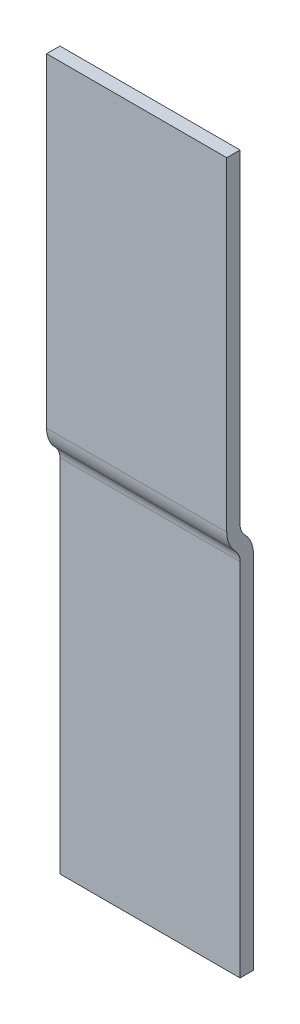
ISO-10303-21;
HEADER;
FILE_DESCRIPTION(('STEP AP214'),'2;1');
FILE_NAME('part.step','',(''),(''),'','','');
FILE_SCHEMA(('AUTOMOTIVE_DESIGN { 1 0 10303 214 1 1 1 1 }'));
ENDSEC;
DATA;
#1=APPLICATION_CONTEXT('core data for automotive mechanical design processes');
#2=APPLICATION_PROTOCOL_DEFINITION('international standard','automotive_design',2000,#1);
#3=PRODUCT_CONTEXT('',#1,'mechanical');
#4=PRODUCT('Part','Part','',(#3));
#5=PRODUCT_RELATED_PRODUCT_CATEGORY('part','',(#4));
#6=PRODUCT_DEFINITION_FORMATION('','',#4);
#7=PRODUCT_DEFINITION_CONTEXT('part definition',#1,'design');
#8=PRODUCT_DEFINITION('design','',#6,#7);
#9=PRODUCT_DEFINITION_SHAPE('','',#8);
#10=(LENGTH_UNIT() NAMED_UNIT(*) SI_UNIT(.MILLI.,.METRE.));
#11=(NAMED_UNIT(*) PLANE_ANGLE_UNIT() SI_UNIT($,.RADIAN.));
#12=(NAMED_UNIT(*) SI_UNIT($,.STERADIAN.) SOLID_ANGLE_UNIT());
#13=UNCERTAINTY_MEASURE_WITH_UNIT(LENGTH_MEASURE(1.E-05),#10,'distance_accuracy_value','');
#14=(GEOMETRIC_REPRESENTATION_CONTEXT(3) GLOBAL_UNCERTAINTY_ASSIGNED_CONTEXT((#13)) GLOBAL_UNIT_ASSIGNED_CONTEXT((#10,
#11,#12)) REPRESENTATION_CONTEXT('',''));
#15=CARTESIAN_POINT('',(0.,0.,0.));
#16=DIRECTION('',(0.,0.,1.));
#17=DIRECTION('',(1.,0.,0.));
#18=AXIS2_PLACEMENT_3D('',#15,#16,#17);
#19=CARTESIAN_POINT('',(-2.5,-0.0989022946157156,0.370000000000001));
#20=DIRECTION('',(0.,0.,1.));
#21=DIRECTION('',(1.,0.,0.));
#22=AXIS2_PLACEMENT_3D('',#19,#20,#21);
#23=PLANE('',#22);
#24=DIRECTION('',(0.,-1.,0.));
#25=VECTOR('',#24,1.);
#26=CARTESIAN_POINT('',(2.5,-0.0989022946157156,0.370000000000001));
#27=LINE('',#26,#25);
#28=CARTESIAN_POINT('',(2.5,19.9010977053843,0.37));
#29=VERTEX_POINT('',#28);
#30=CARTESIAN_POINT('',(2.5,10.9010977053843,0.370000000000001));
#31=VERTEX_POINT('',#30);
#32=EDGE_CURVE('E13',#29,#31,#27,.T.);
#33=ORIENTED_EDGE('',*,*,#32,.T.);
#34=DIRECTION('',(-1.,0.,0.));
#35=VECTOR('',#34,1.);
#36=CARTESIAN_POINT('',(-2.5,10.9010977053843,0.370000000000001));
#37=LINE('',#36,#35);
#38=CARTESIAN_POINT('',(-2.5,10.9010977053843,0.370000000000001));
#39=VERTEX_POINT('',#38);
#40=EDGE_CURVE('E159',#31,#39,#37,.T.);
#41=ORIENTED_EDGE('',*,*,#40,.T.);
#42=DIRECTION('',(0.,-1.,0.));
#43=VECTOR('',#42,1.);
#44=CARTESIAN_POINT('',(-2.5,-0.0989022946157156,0.370000000000001));
#45=LINE('',#44,#43);
#46=CARTESIAN_POINT('',(-2.5,19.9010977053843,0.37));
#47=VERTEX_POINT('',#46);
#48=EDGE_CURVE('E299',#47,#39,#45,.T.);
#49=ORIENTED_EDGE('',*,*,#48,.F.);
#50=DIRECTION('',(1.,0.,0.));
#51=VECTOR('',#50,1.);
#52=CARTESIAN_POINT('',(-2.5,19.9010977053843,0.370000000000001));
#53=LINE('',#52,#51);
#54=EDGE_CURVE('E319',#47,#29,#53,.T.);
#55=ORIENTED_EDGE('',*,*,#54,.T.);
#56=EDGE_LOOP('',(#33,#41,#49,#55));
#57=FACE_BOUND('',#56,.T.);
#58=ADVANCED_FACE('F149',(#57),#23,.F.);
#59=CARTESIAN_POINT('',(-2.5,-0.098902294615716,0.740000000000001));
#60=DIRECTION('',(0.,0.,-1.));
#61=DIRECTION('',(-1.,0.,0.));
#62=AXIS2_PLACEMENT_3D('',#59,#60,#61);
#63=PLANE('',#62);
#64=DIRECTION('',(0.,1.,0.));
#65=VECTOR('',#64,1.);
#66=CARTESIAN_POINT('',(-2.5,-0.098902294615716,0.740000000000001));
#67=LINE('',#66,#65);
#68=CARTESIAN_POINT('',(-2.5,10.9010977053843,0.740000000000001));
#69=VERTEX_POINT('',#68);
#70=CARTESIAN_POINT('',(-2.5,19.9010977053843,0.740000000000002));
#71=VERTEX_POINT('',#70);
#72=EDGE_CURVE('E296',#69,#71,#67,.T.);
#73=ORIENTED_EDGE('',*,*,#72,.F.);
#74=DIRECTION('',(1.,0.,0.));
#75=VECTOR('',#74,1.);
#76=CARTESIAN_POINT('',(-2.5,10.9010977053843,0.74));
#77=LINE('',#76,#75);
#78=CARTESIAN_POINT('',(2.5,10.9010977053843,0.740000000000001));
#79=VERTEX_POINT('',#78);
#80=EDGE_CURVE('E321',#69,#79,#77,.T.);
#81=ORIENTED_EDGE('',*,*,#80,.T.);
#82=DIRECTION('',(0.,1.,0.));
#83=VECTOR('',#82,1.);
#84=CARTESIAN_POINT('',(2.5,-0.098902294615716,0.740000000000001));
#85=LINE('',#84,#83);
#86=CARTESIAN_POINT('',(2.5,19.9010977053843,0.740000000000002));
#87=VERTEX_POINT('',#86);
#88=EDGE_CURVE('E305',#79,#87,#85,.T.);
#89=ORIENTED_EDGE('',*,*,#88,.T.);
#90=DIRECTION('',(1.,0.,0.));
#91=VECTOR('',#90,1.);
#92=CARTESIAN_POINT('',(-2.5,19.9010977053843,0.740000000000002));
#93=LINE('',#92,#91);
#94=EDGE_CURVE('E277',#71,#87,#93,.T.);
#95=ORIENTED_EDGE('',*,*,#94,.F.);
#96=EDGE_LOOP('',(#73,#81,#89,#95));
#97=FACE_BOUND('',#96,.T.);
#98=ADVANCED_FACE('F348',(#97),#63,.F.);
#99=CARTESIAN_POINT('',(-2.5,16.9041833862942,7.6857958462958));
#100=DIRECTION('',(1.,0.,0.));
#101=DIRECTION('',(0.,-0.707106781186549,-0.707106781186546));
#102=AXIS2_PLACEMENT_3D('',#99,#100,#101);
#103=PLANE('',#102);
#104=ORIENTED_EDGE('',*,*,#48,.T.);
#105=CARTESIAN_POINT('',(-2.5,10.9010977053843,-0.0766295090390216));
#106=DIRECTION('',(1.,0.,0.));
#107=DIRECTION('',(0.,0.,-1.));
#108=AXIS2_PLACEMENT_3D('',#105,#106,#107);
#109=CIRCLE('',#108,0.446629509039023);
#110=CARTESIAN_POINT('',(-2.5,10.5852829508648,0.239185245480489));
#111=VERTEX_POINT('',#110);
#112=EDGE_CURVE('E240',#39,#111,#109,.T.);
#113=ORIENTED_EDGE('',*,*,#112,.T.);
#114=CARTESIAN_POINT('',(-2.5,10.0078386873062,0.816629509039022));
#115=DIRECTION('',(-1.,0.,0.));
#116=DIRECTION('',(0.,0.,-1.));
#117=AXIS2_PLACEMENT_3D('',#114,#115,#116);
#118=CIRCLE('',#117,0.816629509039022);
#119=CARTESIAN_POINT('',(-2.5,10.0078386873062,0.));
#120=VERTEX_POINT('',#119);
#121=EDGE_CURVE('E234',#111,#120,#118,.T.);
#122=ORIENTED_EDGE('',*,*,#121,.T.);
#123=DIRECTION('',(0.,-1.,0.));
#124=VECTOR('',#123,1.);
#125=CARTESIAN_POINT('',(-2.5,0.,0.));
#126=LINE('',#125,#124);
#127=CARTESIAN_POINT('',(-2.5,0.,0.));
#128=VERTEX_POINT('',#127);
#129=EDGE_CURVE('E223',#120,#128,#126,.T.);
#130=ORIENTED_EDGE('',*,*,#129,.T.);
#131=DIRECTION('',(0.,0.,1.));
#132=VECTOR('',#131,1.);
#133=CARTESIAN_POINT('',(-2.5,0.,0.37));
#134=LINE('',#133,#132);
#135=CARTESIAN_POINT('',(-2.5,0.,0.37));
#136=VERTEX_POINT('',#135);
#137=EDGE_CURVE('E235',#128,#136,#134,.T.);
#138=ORIENTED_EDGE('',*,*,#137,.T.);
#139=DIRECTION('',(0.,1.,0.));
#140=VECTOR('',#139,1.);
#141=CARTESIAN_POINT('',(-2.5,0.,0.37));
#142=LINE('',#141,#140);
#143=CARTESIAN_POINT('',(-2.5,10.0078386873062,0.37));
#144=VERTEX_POINT('',#143);
#145=EDGE_CURVE('E324',#136,#144,#142,.T.);
#146=ORIENTED_EDGE('',*,*,#145,.T.);
#147=CARTESIAN_POINT('',(-2.5,10.0078386873062,0.816629509039022));
#148=DIRECTION('',(1.,0.,0.));
#149=DIRECTION('',(0.,0.,-1.));
#150=AXIS2_PLACEMENT_3D('',#147,#148,#149);
#151=CIRCLE('',#150,0.446629509039022);
#152=CARTESIAN_POINT('',(-2.5,10.3236534418258,0.500814754519512));
#153=VERTEX_POINT('',#152);
#154=EDGE_CURVE('E313',#144,#153,#151,.T.);
#155=ORIENTED_EDGE('',*,*,#154,.T.);
#156=CARTESIAN_POINT('',(-2.5,10.9010977053843,-0.0766295090390216));
#157=DIRECTION('',(1.,0.,0.));
#158=DIRECTION('',(0.,0.,-1.));
#159=AXIS2_PLACEMENT_3D('',#156,#157,#158);
#160=CIRCLE('',#159,0.816629509039023);
#161=EDGE_CURVE('E243',#153,#69,#160,.F.);
#162=ORIENTED_EDGE('',*,*,#161,.T.);
#163=ORIENTED_EDGE('',*,*,#72,.T.);
#164=DIRECTION('',(0.,0.,-1.));
#165=VECTOR('',#164,1.);
#166=CARTESIAN_POINT('',(-2.5,19.9010977053843,0.740000000000002));
#167=LINE('',#166,#165);
#168=EDGE_CURVE('E300',#71,#47,#167,.T.);
#169=ORIENTED_EDGE('',*,*,#168,.T.);
#170=EDGE_LOOP('',(#104,#113,#122,#130,#138,#146,#155,#162,#163,#169));
#171=FACE_BOUND('',#170,.T.);
#172=ADVANCED_FACE('F239',(#171),#103,.F.);
#173=CARTESIAN_POINT('',(2.5,-0.0989022946157156,0.370000000000001));
#174=DIRECTION('',(-1.,0.,0.));
#175=DIRECTION('',(0.,0.,1.));
#176=AXIS2_PLACEMENT_3D('',#173,#174,#175);
#177=PLANE('',#176);
#178=ORIENTED_EDGE('',*,*,#88,.F.);
#179=CARTESIAN_POINT('',(2.5,10.9010977053843,-0.0766295090390216));
#180=DIRECTION('',(1.,0.,0.));
#181=DIRECTION('',(0.,0.,-1.));
#182=AXIS2_PLACEMENT_3D('',#179,#180,#181);
#183=CIRCLE('',#182,0.816629509039023);
#184=CARTESIAN_POINT('',(2.5,10.3236534418258,0.500814754519512));
#185=VERTEX_POINT('',#184);
#186=EDGE_CURVE('E307',#185,#79,#183,.F.);
#187=ORIENTED_EDGE('',*,*,#186,.F.);
#188=CARTESIAN_POINT('',(2.5,10.0078386873062,0.816629509039022));
#189=DIRECTION('',(1.,0.,0.));
#190=DIRECTION('',(0.,0.,-1.));
#191=AXIS2_PLACEMENT_3D('',#188,#189,#190);
#192=CIRCLE('',#191,0.446629509039022);
#193=CARTESIAN_POINT('',(2.5,10.0078386873062,0.37));
#194=VERTEX_POINT('',#193);
#195=EDGE_CURVE('E254',#194,#185,#192,.T.);
#196=ORIENTED_EDGE('',*,*,#195,.F.);
#197=DIRECTION('',(0.,1.,0.));
#198=VECTOR('',#197,1.);
#199=CARTESIAN_POINT('',(2.5,0.,0.37));
#200=LINE('',#199,#198);
#201=CARTESIAN_POINT('',(2.5,0.,0.37));
#202=VERTEX_POINT('',#201);
#203=EDGE_CURVE('E267',#202,#194,#200,.T.);
#204=ORIENTED_EDGE('',*,*,#203,.F.);
#205=DIRECTION('',(0.,0.,1.));
#206=VECTOR('',#205,1.);
#207=CARTESIAN_POINT('',(2.5,0.,0.37));
#208=LINE('',#207,#206);
#209=CARTESIAN_POINT('',(2.5,0.,0.));
#210=VERTEX_POINT('',#209);
#211=EDGE_CURVE('E286',#210,#202,#208,.T.);
#212=ORIENTED_EDGE('',*,*,#211,.F.);
#213=DIRECTION('',(0.,-1.,0.));
#214=VECTOR('',#213,1.);
#215=CARTESIAN_POINT('',(2.5,0.,0.));
#216=LINE('',#215,#214);
#217=CARTESIAN_POINT('',(2.5,10.0078386873062,0.));
#218=VERTEX_POINT('',#217);
#219=EDGE_CURVE('E282',#218,#210,#216,.T.);
#220=ORIENTED_EDGE('',*,*,#219,.F.);
#221=CARTESIAN_POINT('',(2.5,10.0078386873062,0.816629509039022));
#222=DIRECTION('',(-1.,0.,0.));
#223=DIRECTION('',(0.,0.,-1.));
#224=AXIS2_PLACEMENT_3D('',#221,#222,#223);
#225=CIRCLE('',#224,0.816629509039022);
#226=CARTESIAN_POINT('',(2.5,10.5852829508648,0.239185245480489));
#227=VERTEX_POINT('',#226);
#228=EDGE_CURVE('E247',#227,#218,#225,.T.);
#229=ORIENTED_EDGE('',*,*,#228,.F.);
#230=CARTESIAN_POINT('',(2.5,10.9010977053843,-0.0766295090390216));
#231=DIRECTION('',(1.,0.,0.));
#232=DIRECTION('',(0.,0.,-1.));
#233=AXIS2_PLACEMENT_3D('',#230,#231,#232);
#234=CIRCLE('',#233,0.446629509039023);
#235=EDGE_CURVE('E153',#31,#227,#234,.T.);
#236=ORIENTED_EDGE('',*,*,#235,.F.);
#237=ORIENTED_EDGE('',*,*,#32,.F.);
#238=DIRECTION('',(0.,0.,-1.));
#239=VECTOR('',#238,1.);
#240=CARTESIAN_POINT('',(2.5,19.9010977053843,0.740000000000002));
#241=LINE('',#240,#239);
#242=EDGE_CURVE('E272',#87,#29,#241,.T.);
#243=ORIENTED_EDGE('',*,*,#242,.F.);
#244=EDGE_LOOP('',(#178,#187,#196,#204,#212,#220,#229,#236,#237,#243));
#245=FACE_BOUND('',#244,.T.);
#246=ADVANCED_FACE('F350',(#245),#177,.F.);
#247=CARTESIAN_POINT('',(-2.50000000050932,10.9010977053843,-0.0766295090390216));
#248=DIRECTION('',(1.,0.,0.));
#249=DIRECTION('',(0.,0.707106781186547,0.707106781186549));
#250=AXIS2_PLACEMENT_3D('',#247,#248,#249);
#251=CYLINDRICAL_SURFACE('',#250,0.816629509039023);
#252=ORIENTED_EDGE('',*,*,#80,.F.);
#253=ORIENTED_EDGE('',*,*,#161,.F.);
#254=DIRECTION('',(1.,0.,0.));
#255=VECTOR('',#254,1.);
#256=CARTESIAN_POINT('',(-2.5,10.3236534418258,0.500814754519512));
#257=LINE('',#256,#255);
#258=EDGE_CURVE('E308',#153,#185,#257,.T.);
#259=ORIENTED_EDGE('',*,*,#258,.T.);
#260=ORIENTED_EDGE('',*,*,#186,.T.);
#261=EDGE_LOOP('',(#252,#253,#259,#260));
#262=FACE_BOUND('',#261,.T.);
#263=ADVANCED_FACE('F357',(#262),#251,.T.);
#264=CARTESIAN_POINT('',(-2.50000000050932,10.9010977053843,-0.0766295090390216));
#265=DIRECTION('',(1.,0.,0.));
#266=DIRECTION('',(0.,0.707106781186547,0.707106781186549));
#267=AXIS2_PLACEMENT_3D('',#264,#265,#266);
#268=CYLINDRICAL_SURFACE('',#267,0.446629509039023);
#269=ORIENTED_EDGE('',*,*,#40,.F.);
#270=ORIENTED_EDGE('',*,*,#235,.T.);
#271=DIRECTION('',(-1.,0.,0.));
#272=VECTOR('',#271,1.);
#273=CARTESIAN_POINT('',(-2.5,10.5852829508648,0.23918524548049));
#274=LINE('',#273,#272);
#275=EDGE_CURVE('E251',#227,#111,#274,.T.);
#276=ORIENTED_EDGE('',*,*,#275,.T.);
#277=ORIENTED_EDGE('',*,*,#112,.F.);
#278=EDGE_LOOP('',(#269,#270,#276,#277));
#279=FACE_BOUND('',#278,.T.);
#280=ADVANCED_FACE('F359',(#279),#268,.F.);
#281=CARTESIAN_POINT('',(-2.50000000050932,10.0078386873062,0.816629509039022));
#282=DIRECTION('',(1.,0.,0.));
#283=DIRECTION('',(0.,1.,0.));
#284=AXIS2_PLACEMENT_3D('',#281,#282,#283);
#285=CYLINDRICAL_SURFACE('',#284,0.816629509039022);
#286=ORIENTED_EDGE('',*,*,#275,.F.);
#287=ORIENTED_EDGE('',*,*,#228,.T.);
#288=DIRECTION('',(-1.,0.,0.));
#289=VECTOR('',#288,1.);
#290=CARTESIAN_POINT('',(-2.5,10.0078386873062,0.));
#291=LINE('',#290,#289);
#292=EDGE_CURVE('E228',#218,#120,#291,.T.);
#293=ORIENTED_EDGE('',*,*,#292,.T.);
#294=ORIENTED_EDGE('',*,*,#121,.F.);
#295=EDGE_LOOP('',(#286,#287,#293,#294));
#296=FACE_BOUND('',#295,.T.);
#297=ADVANCED_FACE('F245',(#296),#285,.T.);
#298=CARTESIAN_POINT('',(-2.50000000050932,10.0078386873062,0.816629509039022));
#299=DIRECTION('',(1.,0.,0.));
#300=DIRECTION('',(0.,1.,0.));
#301=AXIS2_PLACEMENT_3D('',#298,#299,#300);
#302=CYLINDRICAL_SURFACE('',#301,0.446629509039022);
#303=ORIENTED_EDGE('',*,*,#258,.F.);
#304=ORIENTED_EDGE('',*,*,#154,.F.);
#305=DIRECTION('',(1.,0.,0.));
#306=VECTOR('',#305,1.);
#307=CARTESIAN_POINT('',(-2.5,10.0078386873062,0.37));
#308=LINE('',#307,#306);
#309=EDGE_CURVE('E249',#144,#194,#308,.T.);
#310=ORIENTED_EDGE('',*,*,#309,.T.);
#311=ORIENTED_EDGE('',*,*,#195,.T.);
#312=EDGE_LOOP('',(#303,#304,#310,#311));
#313=FACE_BOUND('',#312,.T.);
#314=ADVANCED_FACE('F339',(#313),#302,.F.);
#315=CARTESIAN_POINT('',(-2.5,0.,0.37));
#316=DIRECTION('',(0.,0.,-1.));
#317=DIRECTION('',(-1.,0.,0.));
#318=AXIS2_PLACEMENT_3D('',#315,#316,#317);
#319=PLANE('',#318);
#320=ORIENTED_EDGE('',*,*,#309,.F.);
#321=ORIENTED_EDGE('',*,*,#145,.F.);
#322=DIRECTION('',(1.,0.,0.));
#323=VECTOR('',#322,1.);
#324=CARTESIAN_POINT('',(-2.5,0.,0.37));
#325=LINE('',#324,#323);
#326=EDGE_CURVE('E264',#136,#202,#325,.T.);
#327=ORIENTED_EDGE('',*,*,#326,.T.);
#328=ORIENTED_EDGE('',*,*,#203,.T.);
#329=EDGE_LOOP('',(#320,#321,#327,#328));
#330=FACE_BOUND('',#329,.T.);
#331=ADVANCED_FACE('F337',(#330),#319,.F.);
#332=CARTESIAN_POINT('',(-2.5,19.9010977053843,0.740000000000002));
#333=DIRECTION('',(0.,-1.,0.));
#334=DIRECTION('',(0.,0.,-1.));
#335=AXIS2_PLACEMENT_3D('',#332,#333,#334);
#336=PLANE('',#335);
#337=ORIENTED_EDGE('',*,*,#242,.T.);
#338=ORIENTED_EDGE('',*,*,#54,.F.);
#339=ORIENTED_EDGE('',*,*,#168,.F.);
#340=ORIENTED_EDGE('',*,*,#94,.T.);
#341=EDGE_LOOP('',(#337,#338,#339,#340));
#342=FACE_BOUND('',#341,.T.);
#343=ADVANCED_FACE('F354',(#342),#336,.F.);
#344=CARTESIAN_POINT('',(-2.5,0.,0.));
#345=DIRECTION('',(0.,0.,1.));
#346=DIRECTION('',(1.,0.,0.));
#347=AXIS2_PLACEMENT_3D('',#344,#345,#346);
#348=PLANE('',#347);
#349=ORIENTED_EDGE('',*,*,#292,.F.);
#350=ORIENTED_EDGE('',*,*,#219,.T.);
#351=DIRECTION('',(1.,0.,0.));
#352=VECTOR('',#351,1.);
#353=CARTESIAN_POINT('',(-2.5,0.,0.));
#354=LINE('',#353,#352);
#355=EDGE_CURVE('E231',#128,#210,#354,.T.);
#356=ORIENTED_EDGE('',*,*,#355,.F.);
#357=ORIENTED_EDGE('',*,*,#129,.F.);
#358=EDGE_LOOP('',(#349,#350,#356,#357));
#359=FACE_BOUND('',#358,.T.);
#360=ADVANCED_FACE('F225',(#359),#348,.F.);
#361=CARTESIAN_POINT('',(-2.5,0.,0.37));
#362=DIRECTION('',(0.,1.,0.));
#363=DIRECTION('',(0.,0.,1.));
#364=AXIS2_PLACEMENT_3D('',#361,#362,#363);
#365=PLANE('',#364);
#366=ORIENTED_EDGE('',*,*,#211,.T.);
#367=ORIENTED_EDGE('',*,*,#326,.F.);
#368=ORIENTED_EDGE('',*,*,#137,.F.);
#369=ORIENTED_EDGE('',*,*,#355,.T.);
#370=EDGE_LOOP('',(#366,#367,#368,#369));
#371=FACE_BOUND('',#370,.T.);
#372=ADVANCED_FACE('F151',(#371),#365,.F.);
#373=CLOSED_SHELL('',(#58,#98,#172,#246,#263,#280,#297,#314,#331,#343,#360,#372));
#374=MANIFOLD_SOLID_BREP('B2',#373);
#375=ADVANCED_BREP_SHAPE_REPRESENTATION('',(#18,#374),#14);
#376=SHAPE_DEFINITION_REPRESENTATION(#9,#375);
ENDSEC;
END-ISO-10303-21;
